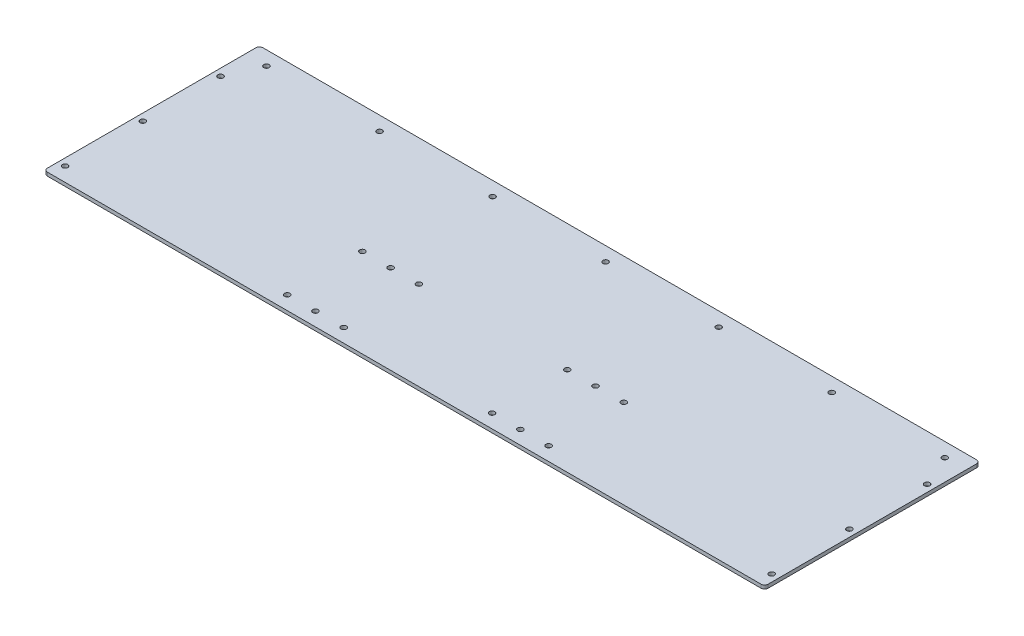
ISO-10303-21;
HEADER;
FILE_DESCRIPTION(('STEP AP214'),'2;1');
FILE_NAME('part.step','',(''),(''),'','','');
FILE_SCHEMA(('AUTOMOTIVE_DESIGN { 1 0 10303 214 1 1 1 1 }'));
ENDSEC;
DATA;
#1=APPLICATION_CONTEXT('core data for automotive mechanical design processes');
#2=APPLICATION_PROTOCOL_DEFINITION('international standard','automotive_design',2000,#1);
#3=PRODUCT_CONTEXT('',#1,'mechanical');
#4=PRODUCT('Part','Part','',(#3));
#5=PRODUCT_RELATED_PRODUCT_CATEGORY('part','',(#4));
#6=PRODUCT_DEFINITION_FORMATION('','',#4);
#7=PRODUCT_DEFINITION_CONTEXT('part definition',#1,'design');
#8=PRODUCT_DEFINITION('design','',#6,#7);
#9=PRODUCT_DEFINITION_SHAPE('','',#8);
#10=(LENGTH_UNIT() NAMED_UNIT(*) SI_UNIT(.MILLI.,.METRE.));
#11=(NAMED_UNIT(*) PLANE_ANGLE_UNIT() SI_UNIT($,.RADIAN.));
#12=(NAMED_UNIT(*) SI_UNIT($,.STERADIAN.) SOLID_ANGLE_UNIT());
#13=UNCERTAINTY_MEASURE_WITH_UNIT(LENGTH_MEASURE(1.E-05),#10,'distance_accuracy_value','');
#14=(GEOMETRIC_REPRESENTATION_CONTEXT(3) GLOBAL_UNCERTAINTY_ASSIGNED_CONTEXT((#13)) GLOBAL_UNIT_ASSIGNED_CONTEXT((#10,
#11,#12)) REPRESENTATION_CONTEXT('',''));
#15=CARTESIAN_POINT('',(0.,0.,0.));
#16=DIRECTION('',(0.,0.,1.));
#17=DIRECTION('',(1.,0.,0.));
#18=AXIS2_PLACEMENT_3D('',#15,#16,#17);
#19=CARTESIAN_POINT('',(0.,3.175,0.));
#20=DIRECTION('',(0.,-1.,0.));
#21=DIRECTION('',(0.,0.,-1.));
#22=AXIS2_PLACEMENT_3D('',#19,#20,#21);
#23=PLANE('',#22);
#24=CARTESIAN_POINT('',(6.34999999999974,3.175,-82.55));
#25=DIRECTION('',(0.,1.,0.));
#26=DIRECTION('',(0.,0.,1.));
#27=AXIS2_PLACEMENT_3D('',#24,#25,#26);
#28=CIRCLE('',#27,2.4257);
#29=CARTESIAN_POINT('',(6.34999999999974,3.175,-80.1243));
#30=VERTEX_POINT('',#29);
#31=EDGE_CURVE('E376',#30,#30,#28,.T.);
#32=ORIENTED_EDGE('',*,*,#31,.F.);
#33=EDGE_LOOP('',(#32));
#34=FACE_BOUND('',#33,.T.);
#35=CARTESIAN_POINT('',(6.34999999999952,3.17499999999999,-152.4));
#36=DIRECTION('',(0.,1.,0.));
#37=DIRECTION('',(0.,0.,1.));
#38=AXIS2_PLACEMENT_3D('',#35,#36,#37);
#39=CIRCLE('',#38,2.4257);
#40=CARTESIAN_POINT('',(6.34999999999952,3.17499999999999,-149.9743));
#41=VERTEX_POINT('',#40);
#42=EDGE_CURVE('E367',#41,#41,#39,.T.);
#43=ORIENTED_EDGE('',*,*,#42,.F.);
#44=EDGE_LOOP('',(#43));
#45=FACE_BOUND('',#44,.T.);
#46=CARTESIAN_POINT('',(641.35,3.17500000000001,-152.4));
#47=DIRECTION('',(0.,1.,0.));
#48=DIRECTION('',(0.,0.,-1.));
#49=AXIS2_PLACEMENT_3D('',#46,#47,#48);
#50=CIRCLE('',#49,2.42570000000009);
#51=CARTESIAN_POINT('',(641.35,3.17500000000001,-154.8257));
#52=VERTEX_POINT('',#51);
#53=EDGE_CURVE('E399',#52,#52,#50,.T.);
#54=ORIENTED_EDGE('',*,*,#53,.F.);
#55=EDGE_LOOP('',(#54));
#56=FACE_BOUND('',#55,.T.);
#57=CARTESIAN_POINT('',(641.35,3.17500000000001,-82.5500000000001));
#58=DIRECTION('',(0.,1.,0.));
#59=DIRECTION('',(0.,0.,-1.));
#60=AXIS2_PLACEMENT_3D('',#57,#58,#59);
#61=CIRCLE('',#60,2.42569999999997);
#62=CARTESIAN_POINT('',(641.35,3.17500000000001,-84.9757));
#63=VERTEX_POINT('',#62);
#64=EDGE_CURVE('E391',#63,#63,#61,.T.);
#65=ORIENTED_EDGE('',*,*,#64,.F.);
#66=EDGE_LOOP('',(#65));
#67=FACE_BOUND('',#66,.T.);
#68=CARTESIAN_POINT('',(641.35,3.17500000000002,-12.7));
#69=DIRECTION('',(0.,1.,0.));
#70=DIRECTION('',(0.,0.,-1.));
#71=AXIS2_PLACEMENT_3D('',#68,#69,#70);
#72=CIRCLE('',#71,2.42569999999997);
#73=CARTESIAN_POINT('',(641.35,3.17500000000002,-15.1257));
#74=VERTEX_POINT('',#73);
#75=EDGE_CURVE('E383',#74,#74,#72,.T.);
#76=ORIENTED_EDGE('',*,*,#75,.F.);
#77=EDGE_LOOP('',(#76));
#78=FACE_BOUND('',#77,.T.);
#79=CARTESIAN_POINT('',(6.34999999999997,3.175,-12.7));
#80=DIRECTION('',(0.,1.,0.));
#81=DIRECTION('',(0.,0.,1.));
#82=AXIS2_PLACEMENT_3D('',#79,#80,#81);
#83=CIRCLE('',#82,2.4257);
#84=CARTESIAN_POINT('',(6.34999999999997,3.175,-10.2743));
#85=VERTEX_POINT('',#84);
#86=EDGE_CURVE('E359',#85,#85,#83,.T.);
#87=ORIENTED_EDGE('',*,*,#86,.F.);
#88=EDGE_LOOP('',(#87));
#89=FACE_BOUND('',#88,.T.);
#90=DIRECTION('',(-1.,0.,0.));
#91=VECTOR('',#90,1.);
#92=CARTESIAN_POINT('',(0.,3.17499999999999,-193.675));
#93=LINE('',#92,#91);
#94=CARTESIAN_POINT('',(644.525,3.17500000000001,-193.675));
#95=VERTEX_POINT('',#94);
#96=CARTESIAN_POINT('',(3.17499999999993,3.17499999999999,-193.675));
#97=VERTEX_POINT('',#96);
#98=EDGE_CURVE('E146',#95,#97,#93,.T.);
#99=ORIENTED_EDGE('',*,*,#98,.T.);
#100=CARTESIAN_POINT('',(3.17499999999993,3.17499999999999,-190.5));
#101=DIRECTION('',(0.,-1.,0.));
#102=DIRECTION('',(0.,0.,-1.));
#103=AXIS2_PLACEMENT_3D('',#100,#101,#102);
#104=CIRCLE('',#103,3.175);
#105=CARTESIAN_POINT('',(0.,3.17499999999999,-190.5));
#106=VERTEX_POINT('',#105);
#107=EDGE_CURVE('E176',#97,#106,#104,.F.);
#108=ORIENTED_EDGE('',*,*,#107,.T.);
#109=DIRECTION('',(0.,0.,1.));
#110=VECTOR('',#109,1.);
#111=CARTESIAN_POINT('',(0.,3.175,0.));
#112=LINE('',#111,#110);
#113=CARTESIAN_POINT('',(0.,3.175,-3.17500000000001));
#114=VERTEX_POINT('',#113);
#115=EDGE_CURVE('E124',#106,#114,#112,.T.);
#116=ORIENTED_EDGE('',*,*,#115,.T.);
#117=CARTESIAN_POINT('',(3.17500000000004,3.175,-3.17500000000001));
#118=DIRECTION('',(0.,-1.,0.));
#119=DIRECTION('',(0.,0.,-1.));
#120=AXIS2_PLACEMENT_3D('',#117,#118,#119);
#121=CIRCLE('',#120,3.175);
#122=CARTESIAN_POINT('',(3.17500000000004,3.175,0.));
#123=VERTEX_POINT('',#122);
#124=EDGE_CURVE('E168',#114,#123,#121,.F.);
#125=ORIENTED_EDGE('',*,*,#124,.T.);
#126=DIRECTION('',(1.,0.,0.));
#127=VECTOR('',#126,1.);
#128=CARTESIAN_POINT('',(0.,3.175,0.));
#129=LINE('',#128,#127);
#130=CARTESIAN_POINT('',(644.525,3.17500000000002,0.));
#131=VERTEX_POINT('',#130);
#132=EDGE_CURVE('E192',#123,#131,#129,.T.);
#133=ORIENTED_EDGE('',*,*,#132,.T.);
#134=CARTESIAN_POINT('',(644.525,3.17500000000002,-3.17499999999996));
#135=DIRECTION('',(0.,-1.,0.));
#136=DIRECTION('',(0.,0.,-1.));
#137=AXIS2_PLACEMENT_3D('',#134,#135,#136);
#138=CIRCLE('',#137,3.175);
#139=CARTESIAN_POINT('',(647.7,3.17500000000002,-3.17499999999996));
#140=VERTEX_POINT('',#139);
#141=EDGE_CURVE('E59',#131,#140,#138,.F.);
#142=ORIENTED_EDGE('',*,*,#141,.T.);
#143=DIRECTION('',(0.,0.,-1.));
#144=VECTOR('',#143,1.);
#145=CARTESIAN_POINT('',(647.7,3.17500000000002,0.));
#146=LINE('',#145,#144);
#147=CARTESIAN_POINT('',(647.7,3.17500000000001,-190.5));
#148=VERTEX_POINT('',#147);
#149=EDGE_CURVE('E200',#140,#148,#146,.T.);
#150=ORIENTED_EDGE('',*,*,#149,.T.);
#151=CARTESIAN_POINT('',(644.525,3.17500000000001,-190.5));
#152=DIRECTION('',(0.,-1.,0.));
#153=DIRECTION('',(0.,0.,-1.));
#154=AXIS2_PLACEMENT_3D('',#151,#152,#153);
#155=CIRCLE('',#154,3.175);
#156=EDGE_CURVE('E173',#148,#95,#155,.F.);
#157=ORIENTED_EDGE('',*,*,#156,.T.);
#158=EDGE_LOOP('',(#99,#108,#116,#125,#133,#142,#150,#157));
#159=FACE_BOUND('',#158,.T.);
#160=CARTESIAN_POINT('',(231.775,3.17500000000001,-12.2555));
#161=DIRECTION('',(0.,1.,0.));
#162=DIRECTION('',(0.,0.,1.));
#163=AXIS2_PLACEMENT_3D('',#160,#161,#162);
#164=CIRCLE('',#163,2.4257);
#165=CARTESIAN_POINT('',(231.775,3.17500000000001,-9.82979999999998));
#166=VERTEX_POINT('',#165);
#167=EDGE_CURVE('E134',#166,#166,#164,.T.);
#168=ORIENTED_EDGE('',*,*,#167,.F.);
#169=EDGE_LOOP('',(#168));
#170=FACE_BOUND('',#169,.T.);
#171=CARTESIAN_POINT('',(257.175,3.17500000000001,-12.2554999999999));
#172=DIRECTION('',(0.,1.,0.));
#173=DIRECTION('',(0.,0.,1.));
#174=AXIS2_PLACEMENT_3D('',#171,#172,#173);
#175=CIRCLE('',#174,2.42569999999997);
#176=CARTESIAN_POINT('',(257.175,3.17500000000001,-9.82979999999998));
#177=VERTEX_POINT('',#176);
#178=EDGE_CURVE('E213',#177,#177,#175,.T.);
#179=ORIENTED_EDGE('',*,*,#178,.F.);
#180=EDGE_LOOP('',(#179));
#181=FACE_BOUND('',#180,.T.);
#182=CARTESIAN_POINT('',(206.375,3.17500000000001,-12.2555));
#183=DIRECTION('',(0.,1.,0.));
#184=DIRECTION('',(0.,0.,-1.));
#185=AXIS2_PLACEMENT_3D('',#182,#183,#184);
#186=CIRCLE('',#185,2.42569999999997);
#187=CARTESIAN_POINT('',(206.375,3.17500000000001,-14.6812));
#188=VERTEX_POINT('',#187);
#189=EDGE_CURVE('E219',#188,#188,#186,.T.);
#190=ORIENTED_EDGE('',*,*,#189,.F.);
#191=EDGE_LOOP('',(#190));
#192=FACE_BOUND('',#191,.T.);
#193=CARTESIAN_POINT('',(257.175,3.175,-79.8195));
#194=DIRECTION('',(0.,1.,0.));
#195=DIRECTION('',(0.,0.,-1.));
#196=AXIS2_PLACEMENT_3D('',#193,#194,#195);
#197=CIRCLE('',#196,2.42569999999997);
#198=CARTESIAN_POINT('',(257.175,3.175,-82.2452));
#199=VERTEX_POINT('',#198);
#200=EDGE_CURVE('E227',#199,#199,#197,.T.);
#201=ORIENTED_EDGE('',*,*,#200,.F.);
#202=EDGE_LOOP('',(#201));
#203=FACE_BOUND('',#202,.T.);
#204=CARTESIAN_POINT('',(231.775,3.175,-79.8195));
#205=DIRECTION('',(0.,1.,0.));
#206=DIRECTION('',(0.,0.,-1.));
#207=AXIS2_PLACEMENT_3D('',#204,#205,#206);
#208=CIRCLE('',#207,2.4257);
#209=CARTESIAN_POINT('',(231.775,3.175,-82.2452));
#210=VERTEX_POINT('',#209);
#211=EDGE_CURVE('E235',#210,#210,#208,.T.);
#212=ORIENTED_EDGE('',*,*,#211,.F.);
#213=EDGE_LOOP('',(#212));
#214=FACE_BOUND('',#213,.T.);
#215=CARTESIAN_POINT('',(206.375,3.175,-79.8195));
#216=DIRECTION('',(0.,1.,0.));
#217=DIRECTION('',(0.,0.,1.));
#218=AXIS2_PLACEMENT_3D('',#215,#216,#217);
#219=CIRCLE('',#218,2.42569999999997);
#220=CARTESIAN_POINT('',(206.375,3.175,-77.3938));
#221=VERTEX_POINT('',#220);
#222=EDGE_CURVE('E243',#221,#221,#219,.T.);
#223=ORIENTED_EDGE('',*,*,#222,.F.);
#224=EDGE_LOOP('',(#223));
#225=FACE_BOUND('',#224,.T.);
#226=CARTESIAN_POINT('',(323.85,3.175,-180.975));
#227=DIRECTION('',(0.,1.,0.));
#228=DIRECTION('',(0.,0.,1.));
#229=AXIS2_PLACEMENT_3D('',#226,#227,#228);
#230=CIRCLE('',#229,2.42569999999997);
#231=CARTESIAN_POINT('',(323.85,3.175,-178.5493));
#232=VERTEX_POINT('',#231);
#233=EDGE_CURVE('E251',#232,#232,#230,.T.);
#234=ORIENTED_EDGE('',*,*,#233,.F.);
#235=EDGE_LOOP('',(#234));
#236=FACE_BOUND('',#235,.T.);
#237=CARTESIAN_POINT('',(425.45,3.17500000000001,-180.975));
#238=DIRECTION('',(0.,1.,0.));
#239=DIRECTION('',(0.,0.,1.));
#240=AXIS2_PLACEMENT_3D('',#237,#238,#239);
#241=CIRCLE('',#240,2.42569999999997);
#242=CARTESIAN_POINT('',(425.45,3.17500000000001,-178.5493));
#243=VERTEX_POINT('',#242);
#244=EDGE_CURVE('E259',#243,#243,#241,.T.);
#245=ORIENTED_EDGE('',*,*,#244,.F.);
#246=EDGE_LOOP('',(#245));
#247=FACE_BOUND('',#246,.T.);
#248=CARTESIAN_POINT('',(527.05,3.17500000000001,-180.975));
#249=DIRECTION('',(0.,1.,0.));
#250=DIRECTION('',(0.,0.,1.));
#251=AXIS2_PLACEMENT_3D('',#248,#249,#250);
#252=CIRCLE('',#251,2.42569999999997);
#253=CARTESIAN_POINT('',(527.05,3.17500000000001,-178.5493));
#254=VERTEX_POINT('',#253);
#255=EDGE_CURVE('E267',#254,#254,#252,.T.);
#256=ORIENTED_EDGE('',*,*,#255,.F.);
#257=EDGE_LOOP('',(#256));
#258=FACE_BOUND('',#257,.T.);
#259=CARTESIAN_POINT('',(628.65,3.17500000000001,-180.975));
#260=DIRECTION('',(0.,1.,0.));
#261=DIRECTION('',(0.,0.,1.));
#262=AXIS2_PLACEMENT_3D('',#259,#260,#261);
#263=CIRCLE('',#262,2.42569999999997);
#264=CARTESIAN_POINT('',(628.65,3.17500000000001,-178.5493));
#265=VERTEX_POINT('',#264);
#266=EDGE_CURVE('E275',#265,#265,#263,.T.);
#267=ORIENTED_EDGE('',*,*,#266,.F.);
#268=EDGE_LOOP('',(#267));
#269=FACE_BOUND('',#268,.T.);
#270=CARTESIAN_POINT('',(120.65,3.175,-180.975));
#271=DIRECTION('',(0.,1.,0.));
#272=DIRECTION('',(0.,0.,-1.));
#273=AXIS2_PLACEMENT_3D('',#270,#271,#272);
#274=CIRCLE('',#273,2.42569999999998);
#275=CARTESIAN_POINT('',(120.65,3.175,-183.4007));
#276=VERTEX_POINT('',#275);
#277=EDGE_CURVE('E283',#276,#276,#274,.T.);
#278=ORIENTED_EDGE('',*,*,#277,.F.);
#279=EDGE_LOOP('',(#278));
#280=FACE_BOUND('',#279,.T.);
#281=CARTESIAN_POINT('',(222.25,3.175,-180.975));
#282=DIRECTION('',(0.,1.,0.));
#283=DIRECTION('',(0.,0.,-1.));
#284=AXIS2_PLACEMENT_3D('',#281,#282,#283);
#285=CIRCLE('',#284,2.42569999999997);
#286=CARTESIAN_POINT('',(222.25,3.175,-183.4007));
#287=VERTEX_POINT('',#286);
#288=EDGE_CURVE('E291',#287,#287,#285,.T.);
#289=ORIENTED_EDGE('',*,*,#288,.F.);
#290=EDGE_LOOP('',(#289));
#291=FACE_BOUND('',#290,.T.);
#292=CARTESIAN_POINT('',(19.05,3.17499999999999,-180.975));
#293=DIRECTION('',(0.,1.,0.));
#294=DIRECTION('',(0.,0.,-1.));
#295=AXIS2_PLACEMENT_3D('',#292,#293,#294);
#296=CIRCLE('',#295,2.42569999999997);
#297=CARTESIAN_POINT('',(19.05,3.17499999999999,-183.4007));
#298=VERTEX_POINT('',#297);
#299=EDGE_CURVE('E299',#298,#298,#296,.T.);
#300=ORIENTED_EDGE('',*,*,#299,.F.);
#301=EDGE_LOOP('',(#300));
#302=FACE_BOUND('',#301,.T.);
#303=CARTESIAN_POINT('',(441.325,3.17500000000001,-79.8195));
#304=DIRECTION('',(0.,1.,0.));
#305=DIRECTION('',(0.,0.,-1.));
#306=AXIS2_PLACEMENT_3D('',#303,#304,#305);
#307=CIRCLE('',#306,2.42569999999997);
#308=CARTESIAN_POINT('',(441.325,3.17500000000001,-82.2452));
#309=VERTEX_POINT('',#308);
#310=EDGE_CURVE('E307',#309,#309,#307,.T.);
#311=ORIENTED_EDGE('',*,*,#310,.F.);
#312=EDGE_LOOP('',(#311));
#313=FACE_BOUND('',#312,.T.);
#314=CARTESIAN_POINT('',(415.925,3.17500000000001,-79.8195));
#315=DIRECTION('',(0.,1.,0.));
#316=DIRECTION('',(0.,0.,1.));
#317=AXIS2_PLACEMENT_3D('',#314,#315,#316);
#318=CIRCLE('',#317,2.42569999999997);
#319=CARTESIAN_POINT('',(415.925,3.17500000000001,-77.3938));
#320=VERTEX_POINT('',#319);
#321=EDGE_CURVE('E315',#320,#320,#318,.T.);
#322=ORIENTED_EDGE('',*,*,#321,.F.);
#323=EDGE_LOOP('',(#322));
#324=FACE_BOUND('',#323,.T.);
#325=CARTESIAN_POINT('',(390.525,3.17500000000001,-79.8195));
#326=DIRECTION('',(0.,1.,0.));
#327=DIRECTION('',(0.,0.,1.));
#328=AXIS2_PLACEMENT_3D('',#325,#326,#327);
#329=CIRCLE('',#328,2.42569999999997);
#330=CARTESIAN_POINT('',(390.525,3.17500000000001,-77.3938));
#331=VERTEX_POINT('',#330);
#332=EDGE_CURVE('E323',#331,#331,#329,.T.);
#333=ORIENTED_EDGE('',*,*,#332,.F.);
#334=EDGE_LOOP('',(#333));
#335=FACE_BOUND('',#334,.T.);
#336=CARTESIAN_POINT('',(441.325,3.17500000000001,-12.2555));
#337=DIRECTION('',(0.,1.,0.));
#338=DIRECTION('',(0.,0.,1.));
#339=AXIS2_PLACEMENT_3D('',#336,#337,#338);
#340=CIRCLE('',#339,2.42569999999997);
#341=CARTESIAN_POINT('',(441.325,3.17500000000001,-9.8298));
#342=VERTEX_POINT('',#341);
#343=EDGE_CURVE('E331',#342,#342,#340,.T.);
#344=ORIENTED_EDGE('',*,*,#343,.F.);
#345=EDGE_LOOP('',(#344));
#346=FACE_BOUND('',#345,.T.);
#347=CARTESIAN_POINT('',(390.525,3.17500000000001,-12.2554999999999));
#348=DIRECTION('',(0.,1.,0.));
#349=DIRECTION('',(0.,0.,-1.));
#350=AXIS2_PLACEMENT_3D('',#347,#348,#349);
#351=CIRCLE('',#350,2.42569999999997);
#352=CARTESIAN_POINT('',(390.525,3.17500000000001,-14.6811999999999));
#353=VERTEX_POINT('',#352);
#354=EDGE_CURVE('E339',#353,#353,#351,.T.);
#355=ORIENTED_EDGE('',*,*,#354,.F.);
#356=EDGE_LOOP('',(#355));
#357=FACE_BOUND('',#356,.T.);
#358=CARTESIAN_POINT('',(415.925,3.17500000000001,-12.2555));
#359=DIRECTION('',(0.,1.,0.));
#360=DIRECTION('',(0.,0.,-1.));
#361=AXIS2_PLACEMENT_3D('',#358,#359,#360);
#362=CIRCLE('',#361,2.42569999999997);
#363=CARTESIAN_POINT('',(415.925,3.17500000000001,-14.6812));
#364=VERTEX_POINT('',#363);
#365=EDGE_CURVE('E347',#364,#364,#362,.T.);
#366=ORIENTED_EDGE('',*,*,#365,.F.);
#367=EDGE_LOOP('',(#366));
#368=FACE_BOUND('',#367,.T.);
#369=ADVANCED_FACE('F36',(#34,#45,#56,#67,#78,#89,#159,#170,#181,#192,#203,#214,#225,#236,#247,
#258,#269,#280,#291,#302,#313,#324,#335,#346,#357,#368),#23,.F.);
#370=CARTESIAN_POINT('',(0.,0.,0.));
#371=DIRECTION('',(0.,-1.,0.));
#372=DIRECTION('',(0.,0.,-1.));
#373=AXIS2_PLACEMENT_3D('',#370,#371,#372);
#374=PLANE('',#373);
#375=CARTESIAN_POINT('',(6.34999999999974,0.,-82.55));
#376=DIRECTION('',(0.,1.,0.));
#377=DIRECTION('',(0.,0.,1.));
#378=AXIS2_PLACEMENT_3D('',#375,#376,#377);
#379=CIRCLE('',#378,2.4257);
#380=CARTESIAN_POINT('',(6.34999999999974,0.,-80.1243));
#381=VERTEX_POINT('',#380);
#382=EDGE_CURVE('E363',#381,#381,#379,.T.);
#383=ORIENTED_EDGE('',*,*,#382,.T.);
#384=EDGE_LOOP('',(#383));
#385=FACE_BOUND('',#384,.T.);
#386=CARTESIAN_POINT('',(6.34999999999952,0.,-152.4));
#387=DIRECTION('',(0.,1.,0.));
#388=DIRECTION('',(0.,0.,1.));
#389=AXIS2_PLACEMENT_3D('',#386,#387,#388);
#390=CIRCLE('',#389,2.4257);
#391=CARTESIAN_POINT('',(6.34999999999952,0.,-149.9743));
#392=VERTEX_POINT('',#391);
#393=EDGE_CURVE('E371',#392,#392,#390,.T.);
#394=ORIENTED_EDGE('',*,*,#393,.T.);
#395=EDGE_LOOP('',(#394));
#396=FACE_BOUND('',#395,.T.);
#397=CARTESIAN_POINT('',(641.35,0.,-152.4));
#398=DIRECTION('',(0.,1.,0.));
#399=DIRECTION('',(0.,0.,-1.));
#400=AXIS2_PLACEMENT_3D('',#397,#398,#399);
#401=CIRCLE('',#400,2.42570000000009);
#402=CARTESIAN_POINT('',(641.35,0.,-154.8257));
#403=VERTEX_POINT('',#402);
#404=EDGE_CURVE('E372',#403,#403,#401,.T.);
#405=ORIENTED_EDGE('',*,*,#404,.T.);
#406=EDGE_LOOP('',(#405));
#407=FACE_BOUND('',#406,.T.);
#408=CARTESIAN_POINT('',(641.35,0.,-82.5500000000001));
#409=DIRECTION('',(0.,1.,0.));
#410=DIRECTION('',(0.,0.,-1.));
#411=AXIS2_PLACEMENT_3D('',#408,#409,#410);
#412=CIRCLE('',#411,2.42569999999997);
#413=CARTESIAN_POINT('',(641.35,0.,-84.9757));
#414=VERTEX_POINT('',#413);
#415=EDGE_CURVE('E395',#414,#414,#412,.T.);
#416=ORIENTED_EDGE('',*,*,#415,.T.);
#417=EDGE_LOOP('',(#416));
#418=FACE_BOUND('',#417,.T.);
#419=CARTESIAN_POINT('',(641.35,0.,-12.7));
#420=DIRECTION('',(0.,1.,0.));
#421=DIRECTION('',(0.,0.,-1.));
#422=AXIS2_PLACEMENT_3D('',#419,#420,#421);
#423=CIRCLE('',#422,2.42569999999997);
#424=CARTESIAN_POINT('',(641.35,0.,-15.1257));
#425=VERTEX_POINT('',#424);
#426=EDGE_CURVE('E387',#425,#425,#423,.T.);
#427=ORIENTED_EDGE('',*,*,#426,.T.);
#428=EDGE_LOOP('',(#427));
#429=FACE_BOUND('',#428,.T.);
#430=CARTESIAN_POINT('',(6.34999999999997,0.,-12.7));
#431=DIRECTION('',(0.,1.,0.));
#432=DIRECTION('',(0.,0.,1.));
#433=AXIS2_PLACEMENT_3D('',#430,#431,#432);
#434=CIRCLE('',#433,2.4257);
#435=CARTESIAN_POINT('',(6.34999999999997,0.,-10.2743));
#436=VERTEX_POINT('',#435);
#437=EDGE_CURVE('E355',#436,#436,#434,.T.);
#438=ORIENTED_EDGE('',*,*,#437,.T.);
#439=EDGE_LOOP('',(#438));
#440=FACE_BOUND('',#439,.T.);
#441=CARTESIAN_POINT('',(390.525,0.,-12.2554999999999));
#442=DIRECTION('',(0.,1.,0.));
#443=DIRECTION('',(0.,0.,-1.));
#444=AXIS2_PLACEMENT_3D('',#441,#442,#443);
#445=CIRCLE('',#444,2.42569999999997);
#446=CARTESIAN_POINT('',(390.525,0.,-14.6811999999999));
#447=VERTEX_POINT('',#446);
#448=EDGE_CURVE('E343',#447,#447,#445,.T.);
#449=ORIENTED_EDGE('',*,*,#448,.T.);
#450=EDGE_LOOP('',(#449));
#451=FACE_BOUND('',#450,.T.);
#452=CARTESIAN_POINT('',(390.525,0.,-79.8195));
#453=DIRECTION('',(0.,1.,0.));
#454=DIRECTION('',(0.,0.,1.));
#455=AXIS2_PLACEMENT_3D('',#452,#453,#454);
#456=CIRCLE('',#455,2.42569999999997);
#457=CARTESIAN_POINT('',(390.525,0.,-77.3938000000001));
#458=VERTEX_POINT('',#457);
#459=EDGE_CURVE('E327',#458,#458,#456,.T.);
#460=ORIENTED_EDGE('',*,*,#459,.T.);
#461=EDGE_LOOP('',(#460));
#462=FACE_BOUND('',#461,.T.);
#463=CARTESIAN_POINT('',(441.325,0.,-79.8195));
#464=DIRECTION('',(0.,1.,0.));
#465=DIRECTION('',(0.,0.,-1.));
#466=AXIS2_PLACEMENT_3D('',#463,#464,#465);
#467=CIRCLE('',#466,2.42569999999997);
#468=CARTESIAN_POINT('',(441.325,0.,-82.2452));
#469=VERTEX_POINT('',#468);
#470=EDGE_CURVE('E311',#469,#469,#467,.T.);
#471=ORIENTED_EDGE('',*,*,#470,.T.);
#472=EDGE_LOOP('',(#471));
#473=FACE_BOUND('',#472,.T.);
#474=CARTESIAN_POINT('',(222.25,0.,-180.975));
#475=DIRECTION('',(0.,1.,0.));
#476=DIRECTION('',(0.,0.,-1.));
#477=AXIS2_PLACEMENT_3D('',#474,#475,#476);
#478=CIRCLE('',#477,2.42569999999997);
#479=CARTESIAN_POINT('',(222.25,0.,-183.4007));
#480=VERTEX_POINT('',#479);
#481=EDGE_CURVE('E295',#480,#480,#478,.T.);
#482=ORIENTED_EDGE('',*,*,#481,.T.);
#483=EDGE_LOOP('',(#482));
#484=FACE_BOUND('',#483,.T.);
#485=CARTESIAN_POINT('',(628.65,0.,-180.975));
#486=DIRECTION('',(0.,1.,0.));
#487=DIRECTION('',(0.,0.,1.));
#488=AXIS2_PLACEMENT_3D('',#485,#486,#487);
#489=CIRCLE('',#488,2.42569999999997);
#490=CARTESIAN_POINT('',(628.65,0.,-178.5493));
#491=VERTEX_POINT('',#490);
#492=EDGE_CURVE('E279',#491,#491,#489,.T.);
#493=ORIENTED_EDGE('',*,*,#492,.T.);
#494=EDGE_LOOP('',(#493));
#495=FACE_BOUND('',#494,.T.);
#496=CARTESIAN_POINT('',(425.45,0.,-180.975));
#497=DIRECTION('',(0.,1.,0.));
#498=DIRECTION('',(0.,0.,1.));
#499=AXIS2_PLACEMENT_3D('',#496,#497,#498);
#500=CIRCLE('',#499,2.42569999999997);
#501=CARTESIAN_POINT('',(425.45,0.,-178.5493));
#502=VERTEX_POINT('',#501);
#503=EDGE_CURVE('E263',#502,#502,#500,.T.);
#504=ORIENTED_EDGE('',*,*,#503,.T.);
#505=EDGE_LOOP('',(#504));
#506=FACE_BOUND('',#505,.T.);
#507=CARTESIAN_POINT('',(206.375,0.,-79.8195));
#508=DIRECTION('',(0.,1.,0.));
#509=DIRECTION('',(0.,0.,1.));
#510=AXIS2_PLACEMENT_3D('',#507,#508,#509);
#511=CIRCLE('',#510,2.42569999999997);
#512=CARTESIAN_POINT('',(206.375,0.,-77.3938));
#513=VERTEX_POINT('',#512);
#514=EDGE_CURVE('E247',#513,#513,#511,.T.);
#515=ORIENTED_EDGE('',*,*,#514,.T.);
#516=EDGE_LOOP('',(#515));
#517=FACE_BOUND('',#516,.T.);
#518=CARTESIAN_POINT('',(257.175,0.,-79.8195));
#519=DIRECTION('',(0.,1.,0.));
#520=DIRECTION('',(0.,0.,-1.));
#521=AXIS2_PLACEMENT_3D('',#518,#519,#520);
#522=CIRCLE('',#521,2.42569999999997);
#523=CARTESIAN_POINT('',(257.175,0.,-82.2452));
#524=VERTEX_POINT('',#523);
#525=EDGE_CURVE('E231',#524,#524,#522,.T.);
#526=ORIENTED_EDGE('',*,*,#525,.T.);
#527=EDGE_LOOP('',(#526));
#528=FACE_BOUND('',#527,.T.);
#529=CARTESIAN_POINT('',(257.175,0.,-12.2554999999999));
#530=DIRECTION('',(0.,1.,0.));
#531=DIRECTION('',(0.,0.,1.));
#532=AXIS2_PLACEMENT_3D('',#529,#530,#531);
#533=CIRCLE('',#532,2.42569999999997);
#534=CARTESIAN_POINT('',(257.175,0.,-9.82979999999998));
#535=VERTEX_POINT('',#534);
#536=EDGE_CURVE('E215',#535,#535,#533,.T.);
#537=ORIENTED_EDGE('',*,*,#536,.T.);
#538=EDGE_LOOP('',(#537));
#539=FACE_BOUND('',#538,.T.);
#540=DIRECTION('',(0.,0.,1.));
#541=VECTOR('',#540,1.);
#542=CARTESIAN_POINT('',(0.,0.,0.));
#543=LINE('',#542,#541);
#544=CARTESIAN_POINT('',(0.,0.,-190.5));
#545=VERTEX_POINT('',#544);
#546=CARTESIAN_POINT('',(0.,0.,-3.17500000000001));
#547=VERTEX_POINT('',#546);
#548=EDGE_CURVE('E121',#545,#547,#543,.T.);
#549=ORIENTED_EDGE('',*,*,#548,.F.);
#550=CARTESIAN_POINT('',(3.17499999999993,0.,-190.5));
#551=DIRECTION('',(0.,-1.,0.));
#552=DIRECTION('',(0.,0.,-1.));
#553=AXIS2_PLACEMENT_3D('',#550,#551,#552);
#554=CIRCLE('',#553,3.175);
#555=CARTESIAN_POINT('',(3.17499999999993,0.,-193.675));
#556=VERTEX_POINT('',#555);
#557=EDGE_CURVE('E103',#545,#556,#554,.T.);
#558=ORIENTED_EDGE('',*,*,#557,.T.);
#559=DIRECTION('',(-1.,0.,0.));
#560=VECTOR('',#559,1.);
#561=CARTESIAN_POINT('',(0.,0.,-193.675));
#562=LINE('',#561,#560);
#563=CARTESIAN_POINT('',(644.525,0.,-193.675));
#564=VERTEX_POINT('',#563);
#565=EDGE_CURVE('E151',#564,#556,#562,.T.);
#566=ORIENTED_EDGE('',*,*,#565,.F.);
#567=CARTESIAN_POINT('',(644.525,0.,-190.5));
#568=DIRECTION('',(0.,-1.,0.));
#569=DIRECTION('',(0.,0.,-1.));
#570=AXIS2_PLACEMENT_3D('',#567,#568,#569);
#571=CIRCLE('',#570,3.175);
#572=CARTESIAN_POINT('',(647.7,0.,-190.5));
#573=VERTEX_POINT('',#572);
#574=EDGE_CURVE('E115',#564,#573,#571,.T.);
#575=ORIENTED_EDGE('',*,*,#574,.T.);
#576=DIRECTION('',(0.,0.,-1.));
#577=VECTOR('',#576,1.);
#578=CARTESIAN_POINT('',(647.7,0.,0.));
#579=LINE('',#578,#577);
#580=CARTESIAN_POINT('',(647.7,0.,-3.17499999999996));
#581=VERTEX_POINT('',#580);
#582=EDGE_CURVE('E140',#581,#573,#579,.T.);
#583=ORIENTED_EDGE('',*,*,#582,.F.);
#584=CARTESIAN_POINT('',(644.525,0.,-3.17499999999996));
#585=DIRECTION('',(0.,-1.,0.));
#586=DIRECTION('',(0.,0.,-1.));
#587=AXIS2_PLACEMENT_3D('',#584,#585,#586);
#588=CIRCLE('',#587,3.175);
#589=CARTESIAN_POINT('',(644.525,0.,0.));
#590=VERTEX_POINT('',#589);
#591=EDGE_CURVE('E158',#581,#590,#588,.T.);
#592=ORIENTED_EDGE('',*,*,#591,.T.);
#593=DIRECTION('',(1.,0.,0.));
#594=VECTOR('',#593,1.);
#595=CARTESIAN_POINT('',(0.,0.,0.));
#596=LINE('',#595,#594);
#597=CARTESIAN_POINT('',(3.17500000000004,0.,0.));
#598=VERTEX_POINT('',#597);
#599=EDGE_CURVE('E133',#598,#590,#596,.T.);
#600=ORIENTED_EDGE('',*,*,#599,.F.);
#601=CARTESIAN_POINT('',(3.17500000000004,0.,-3.17500000000001));
#602=DIRECTION('',(0.,-1.,0.));
#603=DIRECTION('',(0.,0.,-1.));
#604=AXIS2_PLACEMENT_3D('',#601,#602,#603);
#605=CIRCLE('',#604,3.175);
#606=EDGE_CURVE('E126',#598,#547,#605,.T.);
#607=ORIENTED_EDGE('',*,*,#606,.T.);
#608=EDGE_LOOP('',(#549,#558,#566,#575,#583,#592,#600,#607));
#609=FACE_BOUND('',#608,.T.);
#610=CARTESIAN_POINT('',(231.775,0.,-12.2555));
#611=DIRECTION('',(0.,1.,0.));
#612=DIRECTION('',(0.,0.,1.));
#613=AXIS2_PLACEMENT_3D('',#610,#611,#612);
#614=CIRCLE('',#613,2.4257);
#615=CARTESIAN_POINT('',(231.775,0.,-9.82979999999998));
#616=VERTEX_POINT('',#615);
#617=EDGE_CURVE('E143',#616,#616,#614,.T.);
#618=ORIENTED_EDGE('',*,*,#617,.T.);
#619=EDGE_LOOP('',(#618));
#620=FACE_BOUND('',#619,.T.);
#621=CARTESIAN_POINT('',(206.375,0.,-12.2555));
#622=DIRECTION('',(0.,1.,0.));
#623=DIRECTION('',(0.,0.,-1.));
#624=AXIS2_PLACEMENT_3D('',#621,#622,#623);
#625=CIRCLE('',#624,2.42569999999997);
#626=CARTESIAN_POINT('',(206.375,0.,-14.6812));
#627=VERTEX_POINT('',#626);
#628=EDGE_CURVE('E223',#627,#627,#625,.T.);
#629=ORIENTED_EDGE('',*,*,#628,.T.);
#630=EDGE_LOOP('',(#629));
#631=FACE_BOUND('',#630,.T.);
#632=CARTESIAN_POINT('',(231.775,0.,-79.8195));
#633=DIRECTION('',(0.,1.,0.));
#634=DIRECTION('',(0.,0.,-1.));
#635=AXIS2_PLACEMENT_3D('',#632,#633,#634);
#636=CIRCLE('',#635,2.4257);
#637=CARTESIAN_POINT('',(231.775,0.,-82.2452));
#638=VERTEX_POINT('',#637);
#639=EDGE_CURVE('E239',#638,#638,#636,.T.);
#640=ORIENTED_EDGE('',*,*,#639,.T.);
#641=EDGE_LOOP('',(#640));
#642=FACE_BOUND('',#641,.T.);
#643=CARTESIAN_POINT('',(323.85,0.,-180.975));
#644=DIRECTION('',(0.,1.,0.));
#645=DIRECTION('',(0.,0.,1.));
#646=AXIS2_PLACEMENT_3D('',#643,#644,#645);
#647=CIRCLE('',#646,2.42569999999997);
#648=CARTESIAN_POINT('',(323.85,0.,-178.5493));
#649=VERTEX_POINT('',#648);
#650=EDGE_CURVE('E255',#649,#649,#647,.T.);
#651=ORIENTED_EDGE('',*,*,#650,.T.);
#652=EDGE_LOOP('',(#651));
#653=FACE_BOUND('',#652,.T.);
#654=CARTESIAN_POINT('',(527.05,0.,-180.975));
#655=DIRECTION('',(0.,1.,0.));
#656=DIRECTION('',(0.,0.,1.));
#657=AXIS2_PLACEMENT_3D('',#654,#655,#656);
#658=CIRCLE('',#657,2.42569999999997);
#659=CARTESIAN_POINT('',(527.05,0.,-178.5493));
#660=VERTEX_POINT('',#659);
#661=EDGE_CURVE('E271',#660,#660,#658,.T.);
#662=ORIENTED_EDGE('',*,*,#661,.T.);
#663=EDGE_LOOP('',(#662));
#664=FACE_BOUND('',#663,.T.);
#665=CARTESIAN_POINT('',(120.65,0.,-180.975));
#666=DIRECTION('',(0.,1.,0.));
#667=DIRECTION('',(0.,0.,-1.));
#668=AXIS2_PLACEMENT_3D('',#665,#666,#667);
#669=CIRCLE('',#668,2.42569999999998);
#670=CARTESIAN_POINT('',(120.65,0.,-183.4007));
#671=VERTEX_POINT('',#670);
#672=EDGE_CURVE('E287',#671,#671,#669,.T.);
#673=ORIENTED_EDGE('',*,*,#672,.T.);
#674=EDGE_LOOP('',(#673));
#675=FACE_BOUND('',#674,.T.);
#676=CARTESIAN_POINT('',(19.05,0.,-180.975));
#677=DIRECTION('',(0.,1.,0.));
#678=DIRECTION('',(0.,0.,-1.));
#679=AXIS2_PLACEMENT_3D('',#676,#677,#678);
#680=CIRCLE('',#679,2.42569999999997);
#681=CARTESIAN_POINT('',(19.05,0.,-183.4007));
#682=VERTEX_POINT('',#681);
#683=EDGE_CURVE('E303',#682,#682,#680,.T.);
#684=ORIENTED_EDGE('',*,*,#683,.T.);
#685=EDGE_LOOP('',(#684));
#686=FACE_BOUND('',#685,.T.);
#687=CARTESIAN_POINT('',(415.925,0.,-79.8195));
#688=DIRECTION('',(0.,1.,0.));
#689=DIRECTION('',(0.,0.,1.));
#690=AXIS2_PLACEMENT_3D('',#687,#688,#689);
#691=CIRCLE('',#690,2.42569999999997);
#692=CARTESIAN_POINT('',(415.925,0.,-77.3938));
#693=VERTEX_POINT('',#692);
#694=EDGE_CURVE('E319',#693,#693,#691,.T.);
#695=ORIENTED_EDGE('',*,*,#694,.T.);
#696=EDGE_LOOP('',(#695));
#697=FACE_BOUND('',#696,.T.);
#698=CARTESIAN_POINT('',(441.325,0.,-12.2555));
#699=DIRECTION('',(0.,1.,0.));
#700=DIRECTION('',(0.,0.,1.));
#701=AXIS2_PLACEMENT_3D('',#698,#699,#700);
#702=CIRCLE('',#701,2.42569999999997);
#703=CARTESIAN_POINT('',(441.325,0.,-9.8298));
#704=VERTEX_POINT('',#703);
#705=EDGE_CURVE('E335',#704,#704,#702,.T.);
#706=ORIENTED_EDGE('',*,*,#705,.T.);
#707=EDGE_LOOP('',(#706));
#708=FACE_BOUND('',#707,.T.);
#709=CARTESIAN_POINT('',(415.925,0.,-12.2555));
#710=DIRECTION('',(0.,1.,0.));
#711=DIRECTION('',(0.,0.,-1.));
#712=AXIS2_PLACEMENT_3D('',#709,#710,#711);
#713=CIRCLE('',#712,2.42569999999997);
#714=CARTESIAN_POINT('',(415.925,0.,-14.6812));
#715=VERTEX_POINT('',#714);
#716=EDGE_CURVE('E351',#715,#715,#713,.T.);
#717=ORIENTED_EDGE('',*,*,#716,.T.);
#718=EDGE_LOOP('',(#717));
#719=FACE_BOUND('',#718,.T.);
#720=ADVANCED_FACE('F129',(#385,#396,#407,#418,#429,#440,#451,#462,#473,#484,#495,#506,#517,
#528,#539,#609,#620,#631,#642,#653,#664,#675,#686,#697,#708,#719),#374,.T.);
#721=CARTESIAN_POINT('',(0.,3.175,0.));
#722=DIRECTION('',(1.,0.,0.));
#723=DIRECTION('',(0.,0.,-1.));
#724=AXIS2_PLACEMENT_3D('',#721,#722,#723);
#725=PLANE('',#724);
#726=ORIENTED_EDGE('',*,*,#115,.F.);
#727=DIRECTION('',(0.,-1.,0.));
#728=VECTOR('',#727,1.);
#729=CARTESIAN_POINT('',(0.,3.17499999999999,-190.5));
#730=LINE('',#729,#728);
#731=EDGE_CURVE('E107',#106,#545,#730,.T.);
#732=ORIENTED_EDGE('',*,*,#731,.T.);
#733=ORIENTED_EDGE('',*,*,#548,.T.);
#734=DIRECTION('',(0.,-1.,0.));
#735=VECTOR('',#734,1.);
#736=CARTESIAN_POINT('',(0.,3.175,-3.17500000000001));
#737=LINE('',#736,#735);
#738=EDGE_CURVE('E127',#547,#114,#737,.F.);
#739=ORIENTED_EDGE('',*,*,#738,.T.);
#740=EDGE_LOOP('',(#726,#732,#733,#739));
#741=FACE_BOUND('',#740,.T.);
#742=ADVANCED_FACE('F120',(#741),#725,.F.);
#743=CARTESIAN_POINT('',(0.,3.175,0.));
#744=DIRECTION('',(0.,0.,-1.));
#745=DIRECTION('',(-1.,0.,0.));
#746=AXIS2_PLACEMENT_3D('',#743,#744,#745);
#747=PLANE('',#746);
#748=ORIENTED_EDGE('',*,*,#599,.T.);
#749=DIRECTION('',(0.,-1.,0.));
#750=VECTOR('',#749,1.);
#751=CARTESIAN_POINT('',(644.525,3.17500000000002,0.));
#752=LINE('',#751,#750);
#753=EDGE_CURVE('E11',#590,#131,#752,.F.);
#754=ORIENTED_EDGE('',*,*,#753,.T.);
#755=ORIENTED_EDGE('',*,*,#132,.F.);
#756=DIRECTION('',(0.,-1.,0.));
#757=VECTOR('',#756,1.);
#758=CARTESIAN_POINT('',(3.17500000000004,3.175,0.));
#759=LINE('',#758,#757);
#760=EDGE_CURVE('E45',#123,#598,#759,.T.);
#761=ORIENTED_EDGE('',*,*,#760,.T.);
#762=EDGE_LOOP('',(#748,#754,#755,#761));
#763=FACE_BOUND('',#762,.T.);
#764=ADVANCED_FACE('F190',(#763),#747,.F.);
#765=CARTESIAN_POINT('',(647.7,3.17500000000002,0.));
#766=DIRECTION('',(-1.,0.,0.));
#767=DIRECTION('',(0.,0.,1.));
#768=AXIS2_PLACEMENT_3D('',#765,#766,#767);
#769=PLANE('',#768);
#770=ORIENTED_EDGE('',*,*,#582,.T.);
#771=DIRECTION('',(0.,-1.,0.));
#772=VECTOR('',#771,1.);
#773=CARTESIAN_POINT('',(647.7,3.17500000000001,-190.5));
#774=LINE('',#773,#772);
#775=EDGE_CURVE('E52',#573,#148,#774,.F.);
#776=ORIENTED_EDGE('',*,*,#775,.T.);
#777=ORIENTED_EDGE('',*,*,#149,.F.);
#778=DIRECTION('',(0.,-1.,0.));
#779=VECTOR('',#778,1.);
#780=CARTESIAN_POINT('',(647.7,3.17500000000002,-3.17499999999996));
#781=LINE('',#780,#779);
#782=EDGE_CURVE('E179',#140,#581,#781,.T.);
#783=ORIENTED_EDGE('',*,*,#782,.T.);
#784=EDGE_LOOP('',(#770,#776,#777,#783));
#785=FACE_BOUND('',#784,.T.);
#786=ADVANCED_FACE('F199',(#785),#769,.F.);
#787=CARTESIAN_POINT('',(0.,3.17499999999999,-193.675));
#788=DIRECTION('',(0.,0.,1.));
#789=DIRECTION('',(1.,0.,0.));
#790=AXIS2_PLACEMENT_3D('',#787,#788,#789);
#791=PLANE('',#790);
#792=ORIENTED_EDGE('',*,*,#565,.T.);
#793=DIRECTION('',(0.,-1.,0.));
#794=VECTOR('',#793,1.);
#795=CARTESIAN_POINT('',(3.17499999999993,3.17499999999999,-193.675));
#796=LINE('',#795,#794);
#797=EDGE_CURVE('E108',#556,#97,#796,.F.);
#798=ORIENTED_EDGE('',*,*,#797,.T.);
#799=ORIENTED_EDGE('',*,*,#98,.F.);
#800=DIRECTION('',(0.,-1.,0.));
#801=VECTOR('',#800,1.);
#802=CARTESIAN_POINT('',(644.525,3.17500000000001,-193.675));
#803=LINE('',#802,#801);
#804=EDGE_CURVE('E114',#95,#564,#803,.T.);
#805=ORIENTED_EDGE('',*,*,#804,.T.);
#806=EDGE_LOOP('',(#792,#798,#799,#805));
#807=FACE_BOUND('',#806,.T.);
#808=ADVANCED_FACE('F485',(#807),#791,.F.);
#809=CARTESIAN_POINT('',(231.775,3.17500000000001,-12.2555));
#810=DIRECTION('',(0.,-1.,0.));
#811=DIRECTION('',(0.,0.,-1.));
#812=AXIS2_PLACEMENT_3D('',#809,#810,#811);
#813=CYLINDRICAL_SURFACE('',#812,2.4257);
#814=ORIENTED_EDGE('',*,*,#167,.T.);
#815=EDGE_LOOP('',(#814));
#816=FACE_BOUND('',#815,.T.);
#817=ORIENTED_EDGE('',*,*,#617,.F.);
#818=EDGE_LOOP('',(#817));
#819=FACE_BOUND('',#818,.T.);
#820=ADVANCED_FACE('F488',(#816,#819),#813,.F.);
#821=CARTESIAN_POINT('',(257.175,3.17500000000001,-12.2554999999999));
#822=DIRECTION('',(0.,-1.,0.));
#823=DIRECTION('',(0.,0.,-1.));
#824=AXIS2_PLACEMENT_3D('',#821,#822,#823);
#825=CYLINDRICAL_SURFACE('',#824,2.42569999999997);
#826=ORIENTED_EDGE('',*,*,#178,.T.);
#827=EDGE_LOOP('',(#826));
#828=FACE_BOUND('',#827,.T.);
#829=ORIENTED_EDGE('',*,*,#536,.F.);
#830=EDGE_LOOP('',(#829));
#831=FACE_BOUND('',#830,.T.);
#832=ADVANCED_FACE('F739',(#828,#831),#825,.F.);
#833=CARTESIAN_POINT('',(206.375,3.17500000000001,-12.2555));
#834=DIRECTION('',(0.,-1.,0.));
#835=DIRECTION('',(0.,0.,-1.));
#836=AXIS2_PLACEMENT_3D('',#833,#834,#835);
#837=CYLINDRICAL_SURFACE('',#836,2.42569999999997);
#838=ORIENTED_EDGE('',*,*,#189,.T.);
#839=EDGE_LOOP('',(#838));
#840=FACE_BOUND('',#839,.T.);
#841=ORIENTED_EDGE('',*,*,#628,.F.);
#842=EDGE_LOOP('',(#841));
#843=FACE_BOUND('',#842,.T.);
#844=ADVANCED_FACE('F729',(#840,#843),#837,.F.);
#845=CARTESIAN_POINT('',(257.175,3.175,-79.8195));
#846=DIRECTION('',(0.,-1.,0.));
#847=DIRECTION('',(0.,0.,-1.));
#848=AXIS2_PLACEMENT_3D('',#845,#846,#847);
#849=CYLINDRICAL_SURFACE('',#848,2.42569999999997);
#850=ORIENTED_EDGE('',*,*,#200,.T.);
#851=EDGE_LOOP('',(#850));
#852=FACE_BOUND('',#851,.T.);
#853=ORIENTED_EDGE('',*,*,#525,.F.);
#854=EDGE_LOOP('',(#853));
#855=FACE_BOUND('',#854,.T.);
#856=ADVANCED_FACE('F719',(#852,#855),#849,.F.);
#857=CARTESIAN_POINT('',(231.775,3.175,-79.8195));
#858=DIRECTION('',(0.,-1.,0.));
#859=DIRECTION('',(0.,0.,-1.));
#860=AXIS2_PLACEMENT_3D('',#857,#858,#859);
#861=CYLINDRICAL_SURFACE('',#860,2.4257);
#862=ORIENTED_EDGE('',*,*,#211,.T.);
#863=EDGE_LOOP('',(#862));
#864=FACE_BOUND('',#863,.T.);
#865=ORIENTED_EDGE('',*,*,#639,.F.);
#866=EDGE_LOOP('',(#865));
#867=FACE_BOUND('',#866,.T.);
#868=ADVANCED_FACE('F709',(#864,#867),#861,.F.);
#869=CARTESIAN_POINT('',(206.375,3.175,-79.8195));
#870=DIRECTION('',(0.,-1.,0.));
#871=DIRECTION('',(0.,0.,-1.));
#872=AXIS2_PLACEMENT_3D('',#869,#870,#871);
#873=CYLINDRICAL_SURFACE('',#872,2.42569999999997);
#874=ORIENTED_EDGE('',*,*,#222,.T.);
#875=EDGE_LOOP('',(#874));
#876=FACE_BOUND('',#875,.T.);
#877=ORIENTED_EDGE('',*,*,#514,.F.);
#878=EDGE_LOOP('',(#877));
#879=FACE_BOUND('',#878,.T.);
#880=ADVANCED_FACE('F699',(#876,#879),#873,.F.);
#881=CARTESIAN_POINT('',(323.85,3.175,-180.975));
#882=DIRECTION('',(0.,-1.,0.));
#883=DIRECTION('',(0.,0.,-1.));
#884=AXIS2_PLACEMENT_3D('',#881,#882,#883);
#885=CYLINDRICAL_SURFACE('',#884,2.42569999999997);
#886=ORIENTED_EDGE('',*,*,#233,.T.);
#887=EDGE_LOOP('',(#886));
#888=FACE_BOUND('',#887,.T.);
#889=ORIENTED_EDGE('',*,*,#650,.F.);
#890=EDGE_LOOP('',(#889));
#891=FACE_BOUND('',#890,.T.);
#892=ADVANCED_FACE('F689',(#888,#891),#885,.F.);
#893=CARTESIAN_POINT('',(425.45,3.17500000000001,-180.975));
#894=DIRECTION('',(0.,-1.,0.));
#895=DIRECTION('',(0.,0.,-1.));
#896=AXIS2_PLACEMENT_3D('',#893,#894,#895);
#897=CYLINDRICAL_SURFACE('',#896,2.42569999999997);
#898=ORIENTED_EDGE('',*,*,#244,.T.);
#899=EDGE_LOOP('',(#898));
#900=FACE_BOUND('',#899,.T.);
#901=ORIENTED_EDGE('',*,*,#503,.F.);
#902=EDGE_LOOP('',(#901));
#903=FACE_BOUND('',#902,.T.);
#904=ADVANCED_FACE('F679',(#900,#903),#897,.F.);
#905=CARTESIAN_POINT('',(527.05,3.17500000000001,-180.975));
#906=DIRECTION('',(0.,-1.,0.));
#907=DIRECTION('',(0.,0.,-1.));
#908=AXIS2_PLACEMENT_3D('',#905,#906,#907);
#909=CYLINDRICAL_SURFACE('',#908,2.42569999999997);
#910=ORIENTED_EDGE('',*,*,#255,.T.);
#911=EDGE_LOOP('',(#910));
#912=FACE_BOUND('',#911,.T.);
#913=ORIENTED_EDGE('',*,*,#661,.F.);
#914=EDGE_LOOP('',(#913));
#915=FACE_BOUND('',#914,.T.);
#916=ADVANCED_FACE('F669',(#912,#915),#909,.F.);
#917=CARTESIAN_POINT('',(628.65,3.17500000000001,-180.975));
#918=DIRECTION('',(0.,-1.,0.));
#919=DIRECTION('',(0.,0.,-1.));
#920=AXIS2_PLACEMENT_3D('',#917,#918,#919);
#921=CYLINDRICAL_SURFACE('',#920,2.42569999999997);
#922=ORIENTED_EDGE('',*,*,#266,.T.);
#923=EDGE_LOOP('',(#922));
#924=FACE_BOUND('',#923,.T.);
#925=ORIENTED_EDGE('',*,*,#492,.F.);
#926=EDGE_LOOP('',(#925));
#927=FACE_BOUND('',#926,.T.);
#928=ADVANCED_FACE('F659',(#924,#927),#921,.F.);
#929=CARTESIAN_POINT('',(120.65,3.175,-180.975));
#930=DIRECTION('',(0.,-1.,0.));
#931=DIRECTION('',(0.,0.,-1.));
#932=AXIS2_PLACEMENT_3D('',#929,#930,#931);
#933=CYLINDRICAL_SURFACE('',#932,2.42569999999998);
#934=ORIENTED_EDGE('',*,*,#277,.T.);
#935=EDGE_LOOP('',(#934));
#936=FACE_BOUND('',#935,.T.);
#937=ORIENTED_EDGE('',*,*,#672,.F.);
#938=EDGE_LOOP('',(#937));
#939=FACE_BOUND('',#938,.T.);
#940=ADVANCED_FACE('F649',(#936,#939),#933,.F.);
#941=CARTESIAN_POINT('',(222.25,3.175,-180.975));
#942=DIRECTION('',(0.,-1.,0.));
#943=DIRECTION('',(0.,0.,-1.));
#944=AXIS2_PLACEMENT_3D('',#941,#942,#943);
#945=CYLINDRICAL_SURFACE('',#944,2.42569999999997);
#946=ORIENTED_EDGE('',*,*,#288,.T.);
#947=EDGE_LOOP('',(#946));
#948=FACE_BOUND('',#947,.T.);
#949=ORIENTED_EDGE('',*,*,#481,.F.);
#950=EDGE_LOOP('',(#949));
#951=FACE_BOUND('',#950,.T.);
#952=ADVANCED_FACE('F639',(#948,#951),#945,.F.);
#953=CARTESIAN_POINT('',(19.05,3.17499999999999,-180.975));
#954=DIRECTION('',(0.,-1.,0.));
#955=DIRECTION('',(0.,0.,-1.));
#956=AXIS2_PLACEMENT_3D('',#953,#954,#955);
#957=CYLINDRICAL_SURFACE('',#956,2.42569999999997);
#958=ORIENTED_EDGE('',*,*,#299,.T.);
#959=EDGE_LOOP('',(#958));
#960=FACE_BOUND('',#959,.T.);
#961=ORIENTED_EDGE('',*,*,#683,.F.);
#962=EDGE_LOOP('',(#961));
#963=FACE_BOUND('',#962,.T.);
#964=ADVANCED_FACE('F629',(#960,#963),#957,.F.);
#965=CARTESIAN_POINT('',(441.325,3.17500000000001,-79.8195));
#966=DIRECTION('',(0.,-1.,0.));
#967=DIRECTION('',(0.,0.,-1.));
#968=AXIS2_PLACEMENT_3D('',#965,#966,#967);
#969=CYLINDRICAL_SURFACE('',#968,2.42569999999997);
#970=ORIENTED_EDGE('',*,*,#310,.T.);
#971=EDGE_LOOP('',(#970));
#972=FACE_BOUND('',#971,.T.);
#973=ORIENTED_EDGE('',*,*,#470,.F.);
#974=EDGE_LOOP('',(#973));
#975=FACE_BOUND('',#974,.T.);
#976=ADVANCED_FACE('F619',(#972,#975),#969,.F.);
#977=CARTESIAN_POINT('',(415.925,3.17500000000001,-79.8195));
#978=DIRECTION('',(0.,-1.,0.));
#979=DIRECTION('',(0.,0.,-1.));
#980=AXIS2_PLACEMENT_3D('',#977,#978,#979);
#981=CYLINDRICAL_SURFACE('',#980,2.42569999999997);
#982=ORIENTED_EDGE('',*,*,#321,.T.);
#983=EDGE_LOOP('',(#982));
#984=FACE_BOUND('',#983,.T.);
#985=ORIENTED_EDGE('',*,*,#694,.F.);
#986=EDGE_LOOP('',(#985));
#987=FACE_BOUND('',#986,.T.);
#988=ADVANCED_FACE('F609',(#984,#987),#981,.F.);
#989=CARTESIAN_POINT('',(390.525,3.17500000000001,-79.8195));
#990=DIRECTION('',(0.,-1.,0.));
#991=DIRECTION('',(0.,0.,-1.));
#992=AXIS2_PLACEMENT_3D('',#989,#990,#991);
#993=CYLINDRICAL_SURFACE('',#992,2.42569999999997);
#994=ORIENTED_EDGE('',*,*,#332,.T.);
#995=EDGE_LOOP('',(#994));
#996=FACE_BOUND('',#995,.T.);
#997=ORIENTED_EDGE('',*,*,#459,.F.);
#998=EDGE_LOOP('',(#997));
#999=FACE_BOUND('',#998,.T.);
#1000=ADVANCED_FACE('F599',(#996,#999),#993,.F.);
#1001=CARTESIAN_POINT('',(441.325,3.17500000000001,-12.2555));
#1002=DIRECTION('',(0.,-1.,0.));
#1003=DIRECTION('',(0.,0.,-1.));
#1004=AXIS2_PLACEMENT_3D('',#1001,#1002,#1003);
#1005=CYLINDRICAL_SURFACE('',#1004,2.42569999999997);
#1006=ORIENTED_EDGE('',*,*,#343,.T.);
#1007=EDGE_LOOP('',(#1006));
#1008=FACE_BOUND('',#1007,.T.);
#1009=ORIENTED_EDGE('',*,*,#705,.F.);
#1010=EDGE_LOOP('',(#1009));
#1011=FACE_BOUND('',#1010,.T.);
#1012=ADVANCED_FACE('F589',(#1008,#1011),#1005,.F.);
#1013=CARTESIAN_POINT('',(390.525,3.17500000000001,-12.2554999999999));
#1014=DIRECTION('',(0.,-1.,0.));
#1015=DIRECTION('',(0.,0.,-1.));
#1016=AXIS2_PLACEMENT_3D('',#1013,#1014,#1015);
#1017=CYLINDRICAL_SURFACE('',#1016,2.42569999999997);
#1018=ORIENTED_EDGE('',*,*,#354,.T.);
#1019=EDGE_LOOP('',(#1018));
#1020=FACE_BOUND('',#1019,.T.);
#1021=ORIENTED_EDGE('',*,*,#448,.F.);
#1022=EDGE_LOOP('',(#1021));
#1023=FACE_BOUND('',#1022,.T.);
#1024=ADVANCED_FACE('F471',(#1020,#1023),#1017,.F.);
#1025=CARTESIAN_POINT('',(415.925,3.17500000000001,-12.2555));
#1026=DIRECTION('',(0.,-1.,0.));
#1027=DIRECTION('',(0.,0.,-1.));
#1028=AXIS2_PLACEMENT_3D('',#1025,#1026,#1027);
#1029=CYLINDRICAL_SURFACE('',#1028,2.42569999999997);
#1030=ORIENTED_EDGE('',*,*,#365,.T.);
#1031=EDGE_LOOP('',(#1030));
#1032=FACE_BOUND('',#1031,.T.);
#1033=ORIENTED_EDGE('',*,*,#716,.F.);
#1034=EDGE_LOOP('',(#1033));
#1035=FACE_BOUND('',#1034,.T.);
#1036=ADVANCED_FACE('F467',(#1032,#1035),#1029,.F.);
#1037=CARTESIAN_POINT('',(6.34999999999997,0.,-12.7));
#1038=DIRECTION('',(0.,1.,0.));
#1039=DIRECTION('',(0.,0.,1.));
#1040=AXIS2_PLACEMENT_3D('',#1037,#1038,#1039);
#1041=CYLINDRICAL_SURFACE('',#1040,2.4257);
#1042=ORIENTED_EDGE('',*,*,#437,.F.);
#1043=EDGE_LOOP('',(#1042));
#1044=FACE_BOUND('',#1043,.T.);
#1045=ORIENTED_EDGE('',*,*,#86,.T.);
#1046=EDGE_LOOP('',(#1045));
#1047=FACE_BOUND('',#1046,.T.);
#1048=ADVANCED_FACE('F470',(#1044,#1047),#1041,.F.);
#1049=CARTESIAN_POINT('',(641.35,0.,-12.7));
#1050=DIRECTION('',(0.,1.,0.));
#1051=DIRECTION('',(0.,0.,1.));
#1052=AXIS2_PLACEMENT_3D('',#1049,#1050,#1051);
#1053=CYLINDRICAL_SURFACE('',#1052,2.42569999999997);
#1054=ORIENTED_EDGE('',*,*,#426,.F.);
#1055=EDGE_LOOP('',(#1054));
#1056=FACE_BOUND('',#1055,.T.);
#1057=ORIENTED_EDGE('',*,*,#75,.T.);
#1058=EDGE_LOOP('',(#1057));
#1059=FACE_BOUND('',#1058,.T.);
#1060=ADVANCED_FACE('F555',(#1056,#1059),#1053,.F.);
#1061=CARTESIAN_POINT('',(641.35,0.,-82.5500000000001));
#1062=DIRECTION('',(0.,1.,0.));
#1063=DIRECTION('',(0.,0.,1.));
#1064=AXIS2_PLACEMENT_3D('',#1061,#1062,#1063);
#1065=CYLINDRICAL_SURFACE('',#1064,2.42569999999997);
#1066=ORIENTED_EDGE('',*,*,#415,.F.);
#1067=EDGE_LOOP('',(#1066));
#1068=FACE_BOUND('',#1067,.T.);
#1069=ORIENTED_EDGE('',*,*,#64,.T.);
#1070=EDGE_LOOP('',(#1069));
#1071=FACE_BOUND('',#1070,.T.);
#1072=ADVANCED_FACE('F414',(#1068,#1071),#1065,.F.);
#1073=CARTESIAN_POINT('',(641.35,0.,-152.4));
#1074=DIRECTION('',(0.,1.,0.));
#1075=DIRECTION('',(0.,0.,1.));
#1076=AXIS2_PLACEMENT_3D('',#1073,#1074,#1075);
#1077=CYLINDRICAL_SURFACE('',#1076,2.42570000000009);
#1078=ORIENTED_EDGE('',*,*,#404,.F.);
#1079=EDGE_LOOP('',(#1078));
#1080=FACE_BOUND('',#1079,.T.);
#1081=ORIENTED_EDGE('',*,*,#53,.T.);
#1082=EDGE_LOOP('',(#1081));
#1083=FACE_BOUND('',#1082,.T.);
#1084=ADVANCED_FACE('F410',(#1080,#1083),#1077,.F.);
#1085=CARTESIAN_POINT('',(6.34999999999952,0.,-152.4));
#1086=DIRECTION('',(0.,1.,0.));
#1087=DIRECTION('',(0.,0.,1.));
#1088=AXIS2_PLACEMENT_3D('',#1085,#1086,#1087);
#1089=CYLINDRICAL_SURFACE('',#1088,2.4257);
#1090=ORIENTED_EDGE('',*,*,#393,.F.);
#1091=EDGE_LOOP('',(#1090));
#1092=FACE_BOUND('',#1091,.T.);
#1093=ORIENTED_EDGE('',*,*,#42,.T.);
#1094=EDGE_LOOP('',(#1093));
#1095=FACE_BOUND('',#1094,.T.);
#1096=ADVANCED_FACE('F413',(#1092,#1095),#1089,.F.);
#1097=CARTESIAN_POINT('',(6.34999999999974,0.,-82.55));
#1098=DIRECTION('',(0.,1.,0.));
#1099=DIRECTION('',(0.,0.,1.));
#1100=AXIS2_PLACEMENT_3D('',#1097,#1098,#1099);
#1101=CYLINDRICAL_SURFACE('',#1100,2.4257);
#1102=ORIENTED_EDGE('',*,*,#382,.F.);
#1103=EDGE_LOOP('',(#1102));
#1104=FACE_BOUND('',#1103,.T.);
#1105=ORIENTED_EDGE('',*,*,#31,.T.);
#1106=EDGE_LOOP('',(#1105));
#1107=FACE_BOUND('',#1106,.T.);
#1108=ADVANCED_FACE('F497',(#1104,#1107),#1101,.F.);
#1109=CARTESIAN_POINT('',(3.17499999999993,3.17499999999999,-190.5));
#1110=DIRECTION('',(0.,-1.,0.));
#1111=DIRECTION('',(0.,0.,-1.));
#1112=AXIS2_PLACEMENT_3D('',#1109,#1110,#1111);
#1113=CYLINDRICAL_SURFACE('',#1112,3.175);
#1114=ORIENTED_EDGE('',*,*,#107,.F.);
#1115=ORIENTED_EDGE('',*,*,#797,.F.);
#1116=ORIENTED_EDGE('',*,*,#557,.F.);
#1117=ORIENTED_EDGE('',*,*,#731,.F.);
#1118=EDGE_LOOP('',(#1114,#1115,#1116,#1117));
#1119=FACE_BOUND('',#1118,.T.);
#1120=ADVANCED_FACE('F106',(#1119),#1113,.T.);
#1121=CARTESIAN_POINT('',(644.525,3.17500000000001,-190.5));
#1122=DIRECTION('',(0.,-1.,0.));
#1123=DIRECTION('',(0.,0.,-1.));
#1124=AXIS2_PLACEMENT_3D('',#1121,#1122,#1123);
#1125=CYLINDRICAL_SURFACE('',#1124,3.175);
#1126=ORIENTED_EDGE('',*,*,#156,.F.);
#1127=ORIENTED_EDGE('',*,*,#775,.F.);
#1128=ORIENTED_EDGE('',*,*,#574,.F.);
#1129=ORIENTED_EDGE('',*,*,#804,.F.);
#1130=EDGE_LOOP('',(#1126,#1127,#1128,#1129));
#1131=FACE_BOUND('',#1130,.T.);
#1132=ADVANCED_FACE('F496',(#1131),#1125,.T.);
#1133=CARTESIAN_POINT('',(644.525,3.17500000000002,-3.17499999999996));
#1134=DIRECTION('',(0.,-1.,0.));
#1135=DIRECTION('',(0.,0.,-1.));
#1136=AXIS2_PLACEMENT_3D('',#1133,#1134,#1135);
#1137=CYLINDRICAL_SURFACE('',#1136,3.175);
#1138=ORIENTED_EDGE('',*,*,#141,.F.);
#1139=ORIENTED_EDGE('',*,*,#753,.F.);
#1140=ORIENTED_EDGE('',*,*,#591,.F.);
#1141=ORIENTED_EDGE('',*,*,#782,.F.);
#1142=EDGE_LOOP('',(#1138,#1139,#1140,#1141));
#1143=FACE_BOUND('',#1142,.T.);
#1144=ADVANCED_FACE('F198',(#1143),#1137,.T.);
#1145=CARTESIAN_POINT('',(3.17500000000004,3.175,-3.17500000000001));
#1146=DIRECTION('',(0.,-1.,0.));
#1147=DIRECTION('',(0.,0.,-1.));
#1148=AXIS2_PLACEMENT_3D('',#1145,#1146,#1147);
#1149=CYLINDRICAL_SURFACE('',#1148,3.175);
#1150=ORIENTED_EDGE('',*,*,#124,.F.);
#1151=ORIENTED_EDGE('',*,*,#738,.F.);
#1152=ORIENTED_EDGE('',*,*,#606,.F.);
#1153=ORIENTED_EDGE('',*,*,#760,.F.);
#1154=EDGE_LOOP('',(#1150,#1151,#1152,#1153));
#1155=FACE_BOUND('',#1154,.T.);
#1156=ADVANCED_FACE('F38',(#1155),#1149,.T.);
#1157=CLOSED_SHELL('',(#369,#720,#742,#764,#786,#808,#820,#832,#844,#856,#868,#880,#892,#904,
#916,#928,#940,#952,#964,#976,#988,#1000,#1012,#1024,#1036,#1048,#1060,#1072,#1084,#1096,#1108,
#1120,#1132,#1144,#1156));
#1158=MANIFOLD_SOLID_BREP('B2',#1157);
#1159=ADVANCED_BREP_SHAPE_REPRESENTATION('',(#18,#1158),#14);
#1160=SHAPE_DEFINITION_REPRESENTATION(#9,#1159);
ENDSEC;
END-ISO-10303-21;
